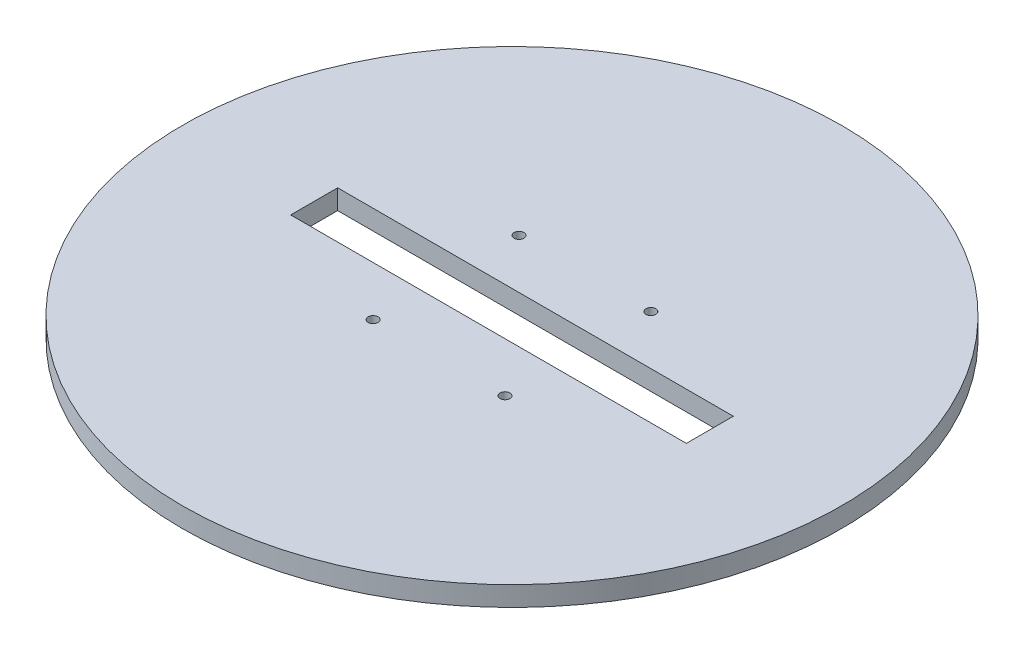
ISO-10303-21;
HEADER;
FILE_DESCRIPTION(('STEP AP214'),'2;1');
FILE_NAME('part.step','',(''),(''),'','','');
FILE_SCHEMA(('AUTOMOTIVE_DESIGN { 1 0 10303 214 1 1 1 1 }'));
ENDSEC;
DATA;
#1=APPLICATION_CONTEXT('core data for automotive mechanical design processes');
#2=APPLICATION_PROTOCOL_DEFINITION('international standard','automotive_design',2000,#1);
#3=PRODUCT_CONTEXT('',#1,'mechanical');
#4=PRODUCT('Part','Part','',(#3));
#5=PRODUCT_RELATED_PRODUCT_CATEGORY('part','',(#4));
#6=PRODUCT_DEFINITION_FORMATION('','',#4);
#7=PRODUCT_DEFINITION_CONTEXT('part definition',#1,'design');
#8=PRODUCT_DEFINITION('design','',#6,#7);
#9=PRODUCT_DEFINITION_SHAPE('','',#8);
#10=(LENGTH_UNIT() NAMED_UNIT(*) SI_UNIT(.MILLI.,.METRE.));
#11=(NAMED_UNIT(*) PLANE_ANGLE_UNIT() SI_UNIT($,.RADIAN.));
#12=(NAMED_UNIT(*) SI_UNIT($,.STERADIAN.) SOLID_ANGLE_UNIT());
#13=UNCERTAINTY_MEASURE_WITH_UNIT(LENGTH_MEASURE(1.E-05),#10,'distance_accuracy_value','');
#14=(GEOMETRIC_REPRESENTATION_CONTEXT(3) GLOBAL_UNCERTAINTY_ASSIGNED_CONTEXT((#13)) GLOBAL_UNIT_ASSIGNED_CONTEXT((#10,
#11,#12)) REPRESENTATION_CONTEXT('',''));
#15=CARTESIAN_POINT('',(0.,0.,0.));
#16=DIRECTION('',(0.,0.,1.));
#17=DIRECTION('',(1.,0.,0.));
#18=AXIS2_PLACEMENT_3D('',#15,#16,#17);
#19=CARTESIAN_POINT('',(60.,6.,0.));
#20=DIRECTION('',(-1.,0.,0.));
#21=DIRECTION('',(0.,0.,1.));
#22=AXIS2_PLACEMENT_3D('',#19,#20,#21);
#23=PLANE('',#22);
#24=DIRECTION('',(0.,0.,-1.));
#25=VECTOR('',#24,1.);
#26=CARTESIAN_POINT('',(60.,0.,0.));
#27=LINE('',#26,#25);
#28=CARTESIAN_POINT('',(60.,0.,7.125));
#29=VERTEX_POINT('',#28);
#30=CARTESIAN_POINT('',(60.,0.,-7.125));
#31=VERTEX_POINT('',#30);
#32=EDGE_CURVE('E124',#29,#31,#27,.T.);
#33=ORIENTED_EDGE('',*,*,#32,.F.);
#34=DIRECTION('',(0.,-1.,0.));
#35=VECTOR('',#34,1.);
#36=CARTESIAN_POINT('',(60.,6.,7.125));
#37=LINE('',#36,#35);
#38=CARTESIAN_POINT('',(60.,6.,7.125));
#39=VERTEX_POINT('',#38);
#40=EDGE_CURVE('E11',#39,#29,#37,.T.);
#41=ORIENTED_EDGE('',*,*,#40,.F.);
#42=DIRECTION('',(0.,0.,-1.));
#43=VECTOR('',#42,1.);
#44=CARTESIAN_POINT('',(60.,6.,0.));
#45=LINE('',#44,#43);
#46=CARTESIAN_POINT('',(60.,6.,-7.125));
#47=VERTEX_POINT('',#46);
#48=EDGE_CURVE('E110',#39,#47,#45,.T.);
#49=ORIENTED_EDGE('',*,*,#48,.T.);
#50=DIRECTION('',(0.,-1.,0.));
#51=VECTOR('',#50,1.);
#52=CARTESIAN_POINT('',(60.,6.,-7.125));
#53=LINE('',#52,#51);
#54=EDGE_CURVE('E88',#47,#31,#53,.T.);
#55=ORIENTED_EDGE('',*,*,#54,.T.);
#56=EDGE_LOOP('',(#33,#41,#49,#55));
#57=FACE_BOUND('',#56,.T.);
#58=ADVANCED_FACE('F49',(#57),#23,.T.);
#59=CARTESIAN_POINT('',(0.,6.,7.125));
#60=DIRECTION('',(0.,0.,-1.));
#61=DIRECTION('',(-1.,0.,0.));
#62=AXIS2_PLACEMENT_3D('',#59,#60,#61);
#63=PLANE('',#62);
#64=DIRECTION('',(1.,0.,0.));
#65=VECTOR('',#64,1.);
#66=CARTESIAN_POINT('',(0.,0.,7.125));
#67=LINE('',#66,#65);
#68=CARTESIAN_POINT('',(-60.,0.,7.125));
#69=VERTEX_POINT('',#68);
#70=EDGE_CURVE('E101',#69,#29,#67,.T.);
#71=ORIENTED_EDGE('',*,*,#70,.F.);
#72=DIRECTION('',(0.,-1.,0.));
#73=VECTOR('',#72,1.);
#74=CARTESIAN_POINT('',(-60.,6.,7.125));
#75=LINE('',#74,#73);
#76=CARTESIAN_POINT('',(-60.,6.,7.125));
#77=VERTEX_POINT('',#76);
#78=EDGE_CURVE('E58',#77,#69,#75,.T.);
#79=ORIENTED_EDGE('',*,*,#78,.F.);
#80=DIRECTION('',(1.,0.,0.));
#81=VECTOR('',#80,1.);
#82=CARTESIAN_POINT('',(0.,6.,7.125));
#83=LINE('',#82,#81);
#84=EDGE_CURVE('E99',#77,#39,#83,.T.);
#85=ORIENTED_EDGE('',*,*,#84,.T.);
#86=ORIENTED_EDGE('',*,*,#40,.T.);
#87=EDGE_LOOP('',(#71,#79,#85,#86));
#88=FACE_BOUND('',#87,.T.);
#89=ADVANCED_FACE('F97',(#88),#63,.T.);
#90=CARTESIAN_POINT('',(-60.,6.,0.));
#91=DIRECTION('',(-1.,0.,0.));
#92=DIRECTION('',(0.,0.,1.));
#93=AXIS2_PLACEMENT_3D('',#90,#91,#92);
#94=PLANE('',#93);
#95=DIRECTION('',(0.,0.,-1.));
#96=VECTOR('',#95,1.);
#97=CARTESIAN_POINT('',(-60.,0.,0.));
#98=LINE('',#97,#96);
#99=CARTESIAN_POINT('',(-60.,0.,-7.125));
#100=VERTEX_POINT('',#99);
#101=EDGE_CURVE('E81',#69,#100,#98,.T.);
#102=ORIENTED_EDGE('',*,*,#101,.T.);
#103=DIRECTION('',(0.,-1.,0.));
#104=VECTOR('',#103,1.);
#105=CARTESIAN_POINT('',(-60.,6.,-7.125));
#106=LINE('',#105,#104);
#107=CARTESIAN_POINT('',(-60.,6.,-7.125));
#108=VERTEX_POINT('',#107);
#109=EDGE_CURVE('E103',#108,#100,#106,.T.);
#110=ORIENTED_EDGE('',*,*,#109,.F.);
#111=DIRECTION('',(0.,0.,-1.));
#112=VECTOR('',#111,1.);
#113=CARTESIAN_POINT('',(-60.,6.,0.));
#114=LINE('',#113,#112);
#115=EDGE_CURVE('E104',#77,#108,#114,.T.);
#116=ORIENTED_EDGE('',*,*,#115,.F.);
#117=ORIENTED_EDGE('',*,*,#78,.T.);
#118=EDGE_LOOP('',(#102,#110,#116,#117));
#119=FACE_BOUND('',#118,.T.);
#120=ADVANCED_FACE('F105',(#119),#94,.F.);
#121=CARTESIAN_POINT('',(0.,6.,-7.125));
#122=DIRECTION('',(0.,0.,-1.));
#123=DIRECTION('',(-1.,0.,0.));
#124=AXIS2_PLACEMENT_3D('',#121,#122,#123);
#125=PLANE('',#124);
#126=DIRECTION('',(1.,0.,0.));
#127=VECTOR('',#126,1.);
#128=CARTESIAN_POINT('',(0.,0.,-7.125));
#129=LINE('',#128,#127);
#130=EDGE_CURVE('E133',#100,#31,#129,.T.);
#131=ORIENTED_EDGE('',*,*,#130,.T.);
#132=ORIENTED_EDGE('',*,*,#54,.F.);
#133=DIRECTION('',(1.,0.,0.));
#134=VECTOR('',#133,1.);
#135=CARTESIAN_POINT('',(0.,6.,-7.125));
#136=LINE('',#135,#134);
#137=EDGE_CURVE('E66',#108,#47,#136,.T.);
#138=ORIENTED_EDGE('',*,*,#137,.F.);
#139=ORIENTED_EDGE('',*,*,#109,.T.);
#140=EDGE_LOOP('',(#131,#132,#138,#139));
#141=FACE_BOUND('',#140,.T.);
#142=ADVANCED_FACE('F144',(#141),#125,.F.);
#143=CARTESIAN_POINT('',(0.,6.,0.));
#144=DIRECTION('',(0.,-1.,0.));
#145=DIRECTION('',(0.,0.,-1.));
#146=AXIS2_PLACEMENT_3D('',#143,#144,#145);
#147=CYLINDRICAL_SURFACE('',#146,99.95);
#148=CARTESIAN_POINT('',(0.,6.,0.));
#149=DIRECTION('',(0.,1.,0.));
#150=DIRECTION('',(0.,0.,1.));
#151=AXIS2_PLACEMENT_3D('',#148,#149,#150);
#152=CIRCLE('',#151,99.95);
#153=CARTESIAN_POINT('',(0.,6.,99.95));
#154=VERTEX_POINT('',#153);
#155=EDGE_CURVE('E120',#154,#154,#152,.T.);
#156=ORIENTED_EDGE('',*,*,#155,.F.);
#157=EDGE_LOOP('',(#156));
#158=FACE_BOUND('',#157,.T.);
#159=CARTESIAN_POINT('',(0.,0.,0.));
#160=DIRECTION('',(0.,1.,0.));
#161=DIRECTION('',(0.,0.,1.));
#162=AXIS2_PLACEMENT_3D('',#159,#160,#161);
#163=CIRCLE('',#162,99.95);
#164=CARTESIAN_POINT('',(0.,0.,99.95));
#165=VERTEX_POINT('',#164);
#166=EDGE_CURVE('E114',#165,#165,#163,.T.);
#167=ORIENTED_EDGE('',*,*,#166,.T.);
#168=EDGE_LOOP('',(#167));
#169=FACE_BOUND('',#168,.T.);
#170=ADVANCED_FACE('F159',(#158,#169),#147,.T.);
#171=CARTESIAN_POINT('',(0.,6.,0.));
#172=DIRECTION('',(0.,1.,0.));
#173=DIRECTION('',(0.,0.,1.));
#174=AXIS2_PLACEMENT_3D('',#171,#172,#173);
#175=PLANE('',#174);
#176=CARTESIAN_POINT('',(-20.,6.,-22.125));
#177=DIRECTION('',(0.,1.,0.));
#178=DIRECTION('',(0.,0.,-1.));
#179=AXIS2_PLACEMENT_3D('',#176,#177,#178);
#180=CIRCLE('',#179,1.5);
#181=CARTESIAN_POINT('',(-20.,6.,-23.625));
#182=VERTEX_POINT('',#181);
#183=EDGE_CURVE('E210',#182,#182,#180,.T.);
#184=ORIENTED_EDGE('',*,*,#183,.F.);
#185=EDGE_LOOP('',(#184));
#186=FACE_BOUND('',#185,.T.);
#187=CARTESIAN_POINT('',(20.,6.,-22.125));
#188=DIRECTION('',(0.,1.,0.));
#189=DIRECTION('',(0.,0.,1.));
#190=AXIS2_PLACEMENT_3D('',#187,#188,#189);
#191=CIRCLE('',#190,1.5);
#192=CARTESIAN_POINT('',(20.,6.,-20.625));
#193=VERTEX_POINT('',#192);
#194=EDGE_CURVE('E200',#193,#193,#191,.T.);
#195=ORIENTED_EDGE('',*,*,#194,.F.);
#196=EDGE_LOOP('',(#195));
#197=FACE_BOUND('',#196,.T.);
#198=CARTESIAN_POINT('',(20.,6.,22.125));
#199=DIRECTION('',(0.,1.,0.));
#200=DIRECTION('',(0.,0.,-1.));
#201=AXIS2_PLACEMENT_3D('',#198,#199,#200);
#202=CIRCLE('',#201,1.5);
#203=CARTESIAN_POINT('',(20.,6.,20.625));
#204=VERTEX_POINT('',#203);
#205=EDGE_CURVE('E192',#204,#204,#202,.T.);
#206=ORIENTED_EDGE('',*,*,#205,.F.);
#207=EDGE_LOOP('',(#206));
#208=FACE_BOUND('',#207,.T.);
#209=CARTESIAN_POINT('',(-20.,6.,22.125));
#210=DIRECTION('',(0.,1.,0.));
#211=DIRECTION('',(0.,0.,1.));
#212=AXIS2_PLACEMENT_3D('',#209,#210,#211);
#213=CIRCLE('',#212,1.5);
#214=CARTESIAN_POINT('',(-20.,6.,23.625));
#215=VERTEX_POINT('',#214);
#216=EDGE_CURVE('E195',#215,#215,#213,.T.);
#217=ORIENTED_EDGE('',*,*,#216,.F.);
#218=EDGE_LOOP('',(#217));
#219=FACE_BOUND('',#218,.T.);
#220=ORIENTED_EDGE('',*,*,#48,.F.);
#221=ORIENTED_EDGE('',*,*,#84,.F.);
#222=ORIENTED_EDGE('',*,*,#115,.T.);
#223=ORIENTED_EDGE('',*,*,#137,.T.);
#224=EDGE_LOOP('',(#220,#221,#222,#223));
#225=FACE_BOUND('',#224,.T.);
#226=ORIENTED_EDGE('',*,*,#155,.T.);
#227=EDGE_LOOP('',(#226));
#228=FACE_BOUND('',#227,.T.);
#229=ADVANCED_FACE('F108',(#186,#197,#208,#219,#225,#228),#175,.T.);
#230=CARTESIAN_POINT('',(0.,0.,0.));
#231=DIRECTION('',(0.,1.,0.));
#232=DIRECTION('',(0.,0.,1.));
#233=AXIS2_PLACEMENT_3D('',#230,#231,#232);
#234=PLANE('',#233);
#235=CARTESIAN_POINT('',(-20.,0.,-22.125));
#236=DIRECTION('',(0.,1.,0.));
#237=DIRECTION('',(0.,0.,-1.));
#238=AXIS2_PLACEMENT_3D('',#235,#236,#237);
#239=CIRCLE('',#238,1.5);
#240=CARTESIAN_POINT('',(-20.,0.,-23.625));
#241=VERTEX_POINT('',#240);
#242=EDGE_CURVE('E214',#241,#241,#239,.T.);
#243=ORIENTED_EDGE('',*,*,#242,.T.);
#244=EDGE_LOOP('',(#243));
#245=FACE_BOUND('',#244,.T.);
#246=CARTESIAN_POINT('',(20.,0.,-22.125));
#247=DIRECTION('',(0.,1.,0.));
#248=DIRECTION('',(0.,0.,1.));
#249=AXIS2_PLACEMENT_3D('',#246,#247,#248);
#250=CIRCLE('',#249,1.5);
#251=CARTESIAN_POINT('',(20.,0.,-20.625));
#252=VERTEX_POINT('',#251);
#253=EDGE_CURVE('E206',#252,#252,#250,.T.);
#254=ORIENTED_EDGE('',*,*,#253,.T.);
#255=EDGE_LOOP('',(#254));
#256=FACE_BOUND('',#255,.T.);
#257=CARTESIAN_POINT('',(20.,0.,22.125));
#258=DIRECTION('',(0.,1.,0.));
#259=DIRECTION('',(0.,0.,-1.));
#260=AXIS2_PLACEMENT_3D('',#257,#258,#259);
#261=CIRCLE('',#260,1.5);
#262=CARTESIAN_POINT('',(20.,0.,20.625));
#263=VERTEX_POINT('',#262);
#264=EDGE_CURVE('E189',#263,#263,#261,.T.);
#265=ORIENTED_EDGE('',*,*,#264,.T.);
#266=EDGE_LOOP('',(#265));
#267=FACE_BOUND('',#266,.T.);
#268=CARTESIAN_POINT('',(-20.,0.,22.125));
#269=DIRECTION('',(0.,1.,0.));
#270=DIRECTION('',(0.,0.,1.));
#271=AXIS2_PLACEMENT_3D('',#268,#269,#270);
#272=CIRCLE('',#271,1.5);
#273=CARTESIAN_POINT('',(-20.,0.,23.625));
#274=VERTEX_POINT('',#273);
#275=EDGE_CURVE('E128',#274,#274,#272,.T.);
#276=ORIENTED_EDGE('',*,*,#275,.T.);
#277=EDGE_LOOP('',(#276));
#278=FACE_BOUND('',#277,.T.);
#279=ORIENTED_EDGE('',*,*,#32,.T.);
#280=ORIENTED_EDGE('',*,*,#130,.F.);
#281=ORIENTED_EDGE('',*,*,#101,.F.);
#282=ORIENTED_EDGE('',*,*,#70,.T.);
#283=EDGE_LOOP('',(#279,#280,#281,#282));
#284=FACE_BOUND('',#283,.T.);
#285=ORIENTED_EDGE('',*,*,#166,.F.);
#286=EDGE_LOOP('',(#285));
#287=FACE_BOUND('',#286,.T.);
#288=ADVANCED_FACE('F146',(#245,#256,#267,#278,#284,#287),#234,.F.);
#289=CARTESIAN_POINT('',(-20.,0.,22.125));
#290=DIRECTION('',(0.,1.,0.));
#291=DIRECTION('',(0.,0.,1.));
#292=AXIS2_PLACEMENT_3D('',#289,#290,#291);
#293=CYLINDRICAL_SURFACE('',#292,1.5);
#294=ORIENTED_EDGE('',*,*,#275,.F.);
#295=EDGE_LOOP('',(#294));
#296=FACE_BOUND('',#295,.T.);
#297=ORIENTED_EDGE('',*,*,#216,.T.);
#298=EDGE_LOOP('',(#297));
#299=FACE_BOUND('',#298,.T.);
#300=ADVANCED_FACE('F165',(#296,#299),#293,.F.);
#301=CARTESIAN_POINT('',(20.,0.,22.125));
#302=DIRECTION('',(0.,1.,0.));
#303=DIRECTION('',(0.,0.,1.));
#304=AXIS2_PLACEMENT_3D('',#301,#302,#303);
#305=CYLINDRICAL_SURFACE('',#304,1.5);
#306=ORIENTED_EDGE('',*,*,#264,.F.);
#307=EDGE_LOOP('',(#306));
#308=FACE_BOUND('',#307,.T.);
#309=ORIENTED_EDGE('',*,*,#205,.T.);
#310=EDGE_LOOP('',(#309));
#311=FACE_BOUND('',#310,.T.);
#312=ADVANCED_FACE('F172',(#308,#311),#305,.F.);
#313=CARTESIAN_POINT('',(20.,0.,-22.125));
#314=DIRECTION('',(0.,1.,0.));
#315=DIRECTION('',(0.,0.,1.));
#316=AXIS2_PLACEMENT_3D('',#313,#314,#315);
#317=CYLINDRICAL_SURFACE('',#316,1.5);
#318=ORIENTED_EDGE('',*,*,#253,.F.);
#319=EDGE_LOOP('',(#318));
#320=FACE_BOUND('',#319,.T.);
#321=ORIENTED_EDGE('',*,*,#194,.T.);
#322=EDGE_LOOP('',(#321));
#323=FACE_BOUND('',#322,.T.);
#324=ADVANCED_FACE('F177',(#320,#323),#317,.F.);
#325=CARTESIAN_POINT('',(-20.,0.,-22.125));
#326=DIRECTION('',(0.,1.,0.));
#327=DIRECTION('',(0.,0.,1.));
#328=AXIS2_PLACEMENT_3D('',#325,#326,#327);
#329=CYLINDRICAL_SURFACE('',#328,1.5);
#330=ORIENTED_EDGE('',*,*,#242,.F.);
#331=EDGE_LOOP('',(#330));
#332=FACE_BOUND('',#331,.T.);
#333=ORIENTED_EDGE('',*,*,#183,.T.);
#334=EDGE_LOOP('',(#333));
#335=FACE_BOUND('',#334,.T.);
#336=ADVANCED_FACE('F174',(#332,#335),#329,.F.);
#337=CLOSED_SHELL('',(#58,#89,#120,#142,#170,#229,#288,#300,#312,#324,#336));
#338=MANIFOLD_SOLID_BREP('B2',#337);
#339=ADVANCED_BREP_SHAPE_REPRESENTATION('',(#18,#338),#14);
#340=SHAPE_DEFINITION_REPRESENTATION(#9,#339);
ENDSEC;
END-ISO-10303-21;
